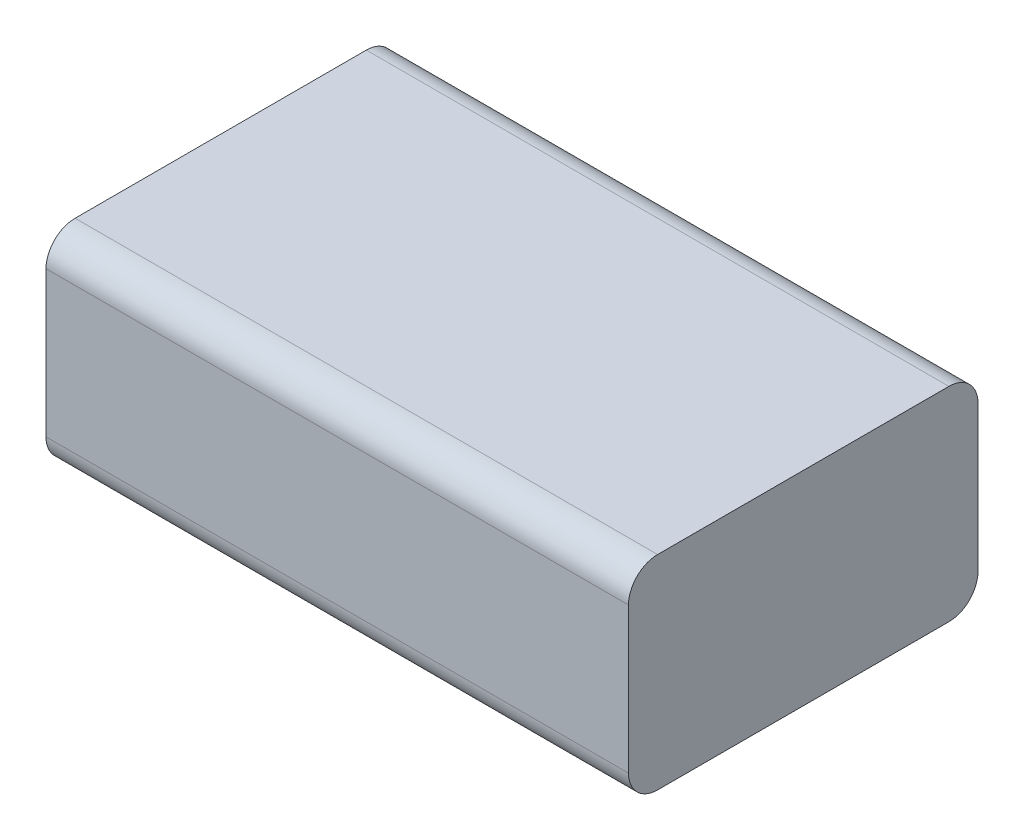
ISO-10303-21;
HEADER;
FILE_DESCRIPTION(('STEP AP214'),'2;1');
FILE_NAME('part.step','',(''),(''),'','','');
FILE_SCHEMA(('AUTOMOTIVE_DESIGN { 1 0 10303 214 1 1 1 1 }'));
ENDSEC;
DATA;
#1=APPLICATION_CONTEXT('core data for automotive mechanical design processes');
#2=APPLICATION_PROTOCOL_DEFINITION('international standard','automotive_design',2000,#1);
#3=PRODUCT_CONTEXT('',#1,'mechanical');
#4=PRODUCT('Part','Part','',(#3));
#5=PRODUCT_RELATED_PRODUCT_CATEGORY('part','',(#4));
#6=PRODUCT_DEFINITION_FORMATION('','',#4);
#7=PRODUCT_DEFINITION_CONTEXT('part definition',#1,'design');
#8=PRODUCT_DEFINITION('design','',#6,#7);
#9=PRODUCT_DEFINITION_SHAPE('','',#8);
#10=(LENGTH_UNIT() NAMED_UNIT(*) SI_UNIT(.MILLI.,.METRE.));
#11=(NAMED_UNIT(*) PLANE_ANGLE_UNIT() SI_UNIT($,.RADIAN.));
#12=(NAMED_UNIT(*) SI_UNIT($,.STERADIAN.) SOLID_ANGLE_UNIT());
#13=UNCERTAINTY_MEASURE_WITH_UNIT(LENGTH_MEASURE(1.E-05),#10,'distance_accuracy_value','');
#14=(GEOMETRIC_REPRESENTATION_CONTEXT(3) GLOBAL_UNCERTAINTY_ASSIGNED_CONTEXT((#13)) GLOBAL_UNIT_ASSIGNED_CONTEXT((#10,
#11,#12)) REPRESENTATION_CONTEXT('',''));
#15=CARTESIAN_POINT('',(0.,0.,0.));
#16=DIRECTION('',(0.,0.,1.));
#17=DIRECTION('',(1.,0.,0.));
#18=AXIS2_PLACEMENT_3D('',#15,#16,#17);
#19=CARTESIAN_POINT('',(50.,35.,30.));
#20=DIRECTION('',(-1.,0.,0.));
#21=DIRECTION('',(0.,0.,1.));
#22=AXIS2_PLACEMENT_3D('',#19,#20,#21);
#23=PLANE('',#22);
#24=DIRECTION('',(0.,0.,-1.));
#25=VECTOR('',#24,1.);
#26=CARTESIAN_POINT('',(50.,0.,30.));
#27=LINE('',#26,#25);
#28=CARTESIAN_POINT('',(50.,0.,25.));
#29=VERTEX_POINT('',#28);
#30=CARTESIAN_POINT('',(50.,0.,-25.));
#31=VERTEX_POINT('',#30);
#32=EDGE_CURVE('E142',#29,#31,#27,.T.);
#33=ORIENTED_EDGE('',*,*,#32,.T.);
#34=CARTESIAN_POINT('',(50.,5.,-25.));
#35=DIRECTION('',(-1.,0.,0.));
#36=DIRECTION('',(0.,0.,1.));
#37=AXIS2_PLACEMENT_3D('',#34,#35,#36);
#38=CIRCLE('',#37,5.);
#39=CARTESIAN_POINT('',(50.,5.,-30.));
#40=VERTEX_POINT('',#39);
#41=EDGE_CURVE('E11',#31,#40,#38,.F.);
#42=ORIENTED_EDGE('',*,*,#41,.T.);
#43=DIRECTION('',(0.,-1.,0.));
#44=VECTOR('',#43,1.);
#45=CARTESIAN_POINT('',(50.,35.,-30.));
#46=LINE('',#45,#44);
#47=CARTESIAN_POINT('',(50.,30.,-30.));
#48=VERTEX_POINT('',#47);
#49=EDGE_CURVE('E130',#48,#40,#46,.T.);
#50=ORIENTED_EDGE('',*,*,#49,.F.);
#51=CARTESIAN_POINT('',(50.,30.,-25.));
#52=DIRECTION('',(-1.,0.,0.));
#53=DIRECTION('',(0.,0.,1.));
#54=AXIS2_PLACEMENT_3D('',#51,#52,#53);
#55=CIRCLE('',#54,5.);
#56=CARTESIAN_POINT('',(50.,35.,-25.));
#57=VERTEX_POINT('',#56);
#58=EDGE_CURVE('E134',#48,#57,#55,.F.);
#59=ORIENTED_EDGE('',*,*,#58,.T.);
#60=DIRECTION('',(0.,0.,-1.));
#61=VECTOR('',#60,1.);
#62=CARTESIAN_POINT('',(50.,35.,30.));
#63=LINE('',#62,#61);
#64=CARTESIAN_POINT('',(50.,35.,25.));
#65=VERTEX_POINT('',#64);
#66=EDGE_CURVE('E124',#65,#57,#63,.T.);
#67=ORIENTED_EDGE('',*,*,#66,.F.);
#68=CARTESIAN_POINT('',(50.,30.,25.));
#69=DIRECTION('',(-1.,0.,0.));
#70=DIRECTION('',(0.,0.,1.));
#71=AXIS2_PLACEMENT_3D('',#68,#69,#70);
#72=CIRCLE('',#71,5.);
#73=CARTESIAN_POINT('',(50.,30.,30.));
#74=VERTEX_POINT('',#73);
#75=EDGE_CURVE('E108',#65,#74,#72,.F.);
#76=ORIENTED_EDGE('',*,*,#75,.T.);
#77=DIRECTION('',(0.,-1.,0.));
#78=VECTOR('',#77,1.);
#79=CARTESIAN_POINT('',(50.,35.,30.));
#80=LINE('',#79,#78);
#81=CARTESIAN_POINT('',(50.,5.,30.));
#82=VERTEX_POINT('',#81);
#83=EDGE_CURVE('E140',#74,#82,#80,.T.);
#84=ORIENTED_EDGE('',*,*,#83,.T.);
#85=CARTESIAN_POINT('',(50.,5.,25.));
#86=DIRECTION('',(-1.,0.,0.));
#87=DIRECTION('',(0.,0.,1.));
#88=AXIS2_PLACEMENT_3D('',#85,#86,#87);
#89=CIRCLE('',#88,5.);
#90=EDGE_CURVE('E179',#82,#29,#89,.F.);
#91=ORIENTED_EDGE('',*,*,#90,.T.);
#92=EDGE_LOOP('',(#33,#42,#50,#59,#67,#76,#84,#91));
#93=FACE_BOUND('',#92,.T.);
#94=ADVANCED_FACE('F43',(#93),#23,.F.);
#95=CARTESIAN_POINT('',(-50.,35.,-30.));
#96=DIRECTION('',(0.,0.,1.));
#97=DIRECTION('',(1.,0.,0.));
#98=AXIS2_PLACEMENT_3D('',#95,#96,#97);
#99=PLANE('',#98);
#100=ORIENTED_EDGE('',*,*,#49,.T.);
#101=DIRECTION('',(-1.,0.,0.));
#102=VECTOR('',#101,1.);
#103=CARTESIAN_POINT('',(-50.,5.,-30.));
#104=LINE('',#103,#102);
#105=CARTESIAN_POINT('',(-50.,5.,-30.));
#106=VERTEX_POINT('',#105);
#107=EDGE_CURVE('E189',#40,#106,#104,.T.);
#108=ORIENTED_EDGE('',*,*,#107,.T.);
#109=DIRECTION('',(0.,-1.,0.));
#110=VECTOR('',#109,1.);
#111=CARTESIAN_POINT('',(-50.,35.,-30.));
#112=LINE('',#111,#110);
#113=CARTESIAN_POINT('',(-50.,30.,-30.));
#114=VERTEX_POINT('',#113);
#115=EDGE_CURVE('E153',#114,#106,#112,.T.);
#116=ORIENTED_EDGE('',*,*,#115,.F.);
#117=DIRECTION('',(-1.,0.,0.));
#118=VECTOR('',#117,1.);
#119=CARTESIAN_POINT('',(-50.,30.,-30.));
#120=LINE('',#119,#118);
#121=EDGE_CURVE('E170',#114,#48,#120,.F.);
#122=ORIENTED_EDGE('',*,*,#121,.T.);
#123=EDGE_LOOP('',(#100,#108,#116,#122));
#124=FACE_BOUND('',#123,.T.);
#125=ADVANCED_FACE('F198',(#124),#99,.F.);
#126=CARTESIAN_POINT('',(-50.,35.,30.));
#127=DIRECTION('',(1.,0.,0.));
#128=DIRECTION('',(0.,0.,-1.));
#129=AXIS2_PLACEMENT_3D('',#126,#127,#128);
#130=PLANE('',#129);
#131=ORIENTED_EDGE('',*,*,#115,.T.);
#132=CARTESIAN_POINT('',(-50.,5.,-25.));
#133=DIRECTION('',(1.,0.,0.));
#134=DIRECTION('',(0.,0.,-1.));
#135=AXIS2_PLACEMENT_3D('',#132,#133,#134);
#136=CIRCLE('',#135,5.);
#137=CARTESIAN_POINT('',(-50.,0.,-25.));
#138=VERTEX_POINT('',#137);
#139=EDGE_CURVE('E66',#106,#138,#136,.F.);
#140=ORIENTED_EDGE('',*,*,#139,.T.);
#141=DIRECTION('',(0.,0.,1.));
#142=VECTOR('',#141,1.);
#143=CARTESIAN_POINT('',(-50.,0.,30.));
#144=LINE('',#143,#142);
#145=CARTESIAN_POINT('',(-50.,0.,25.));
#146=VERTEX_POINT('',#145);
#147=EDGE_CURVE('E136',#138,#146,#144,.T.);
#148=ORIENTED_EDGE('',*,*,#147,.T.);
#149=CARTESIAN_POINT('',(-50.,5.,25.));
#150=DIRECTION('',(1.,0.,0.));
#151=DIRECTION('',(0.,0.,-1.));
#152=AXIS2_PLACEMENT_3D('',#149,#150,#151);
#153=CIRCLE('',#152,5.);
#154=CARTESIAN_POINT('',(-50.,5.,30.));
#155=VERTEX_POINT('',#154);
#156=EDGE_CURVE('E186',#146,#155,#153,.F.);
#157=ORIENTED_EDGE('',*,*,#156,.T.);
#158=DIRECTION('',(0.,-1.,0.));
#159=VECTOR('',#158,1.);
#160=CARTESIAN_POINT('',(-50.,35.,30.));
#161=LINE('',#160,#159);
#162=CARTESIAN_POINT('',(-50.,30.,30.));
#163=VERTEX_POINT('',#162);
#164=EDGE_CURVE('E149',#163,#155,#161,.T.);
#165=ORIENTED_EDGE('',*,*,#164,.F.);
#166=CARTESIAN_POINT('',(-50.,30.,25.));
#167=DIRECTION('',(1.,0.,0.));
#168=DIRECTION('',(0.,0.,-1.));
#169=AXIS2_PLACEMENT_3D('',#166,#167,#168);
#170=CIRCLE('',#169,5.);
#171=CARTESIAN_POINT('',(-50.,35.,25.));
#172=VERTEX_POINT('',#171);
#173=EDGE_CURVE('E161',#163,#172,#170,.F.);
#174=ORIENTED_EDGE('',*,*,#173,.T.);
#175=DIRECTION('',(0.,0.,1.));
#176=VECTOR('',#175,1.);
#177=CARTESIAN_POINT('',(-50.,35.,30.));
#178=LINE('',#177,#176);
#179=CARTESIAN_POINT('',(-50.,35.,-25.));
#180=VERTEX_POINT('',#179);
#181=EDGE_CURVE('E127',#180,#172,#178,.T.);
#182=ORIENTED_EDGE('',*,*,#181,.F.);
#183=CARTESIAN_POINT('',(-50.,30.,-25.));
#184=DIRECTION('',(1.,0.,0.));
#185=DIRECTION('',(0.,0.,-1.));
#186=AXIS2_PLACEMENT_3D('',#183,#184,#185);
#187=CIRCLE('',#186,5.);
#188=EDGE_CURVE('E167',#180,#114,#187,.F.);
#189=ORIENTED_EDGE('',*,*,#188,.T.);
#190=EDGE_LOOP('',(#131,#140,#148,#157,#165,#174,#182,#189));
#191=FACE_BOUND('',#190,.T.);
#192=ADVANCED_FACE('F202',(#191),#130,.F.);
#193=CARTESIAN_POINT('',(-50.,35.,30.));
#194=DIRECTION('',(0.,0.,-1.));
#195=DIRECTION('',(-1.,0.,0.));
#196=AXIS2_PLACEMENT_3D('',#193,#194,#195);
#197=PLANE('',#196);
#198=ORIENTED_EDGE('',*,*,#164,.T.);
#199=DIRECTION('',(1.,0.,0.));
#200=VECTOR('',#199,1.);
#201=CARTESIAN_POINT('',(50.,5.,30.));
#202=LINE('',#201,#200);
#203=EDGE_CURVE('E175',#155,#82,#202,.T.);
#204=ORIENTED_EDGE('',*,*,#203,.T.);
#205=ORIENTED_EDGE('',*,*,#83,.F.);
#206=DIRECTION('',(1.,0.,0.));
#207=VECTOR('',#206,1.);
#208=CARTESIAN_POINT('',(-50.,30.,30.));
#209=LINE('',#208,#207);
#210=EDGE_CURVE('E113',#74,#163,#209,.F.);
#211=ORIENTED_EDGE('',*,*,#210,.T.);
#212=EDGE_LOOP('',(#198,#204,#205,#211));
#213=FACE_BOUND('',#212,.T.);
#214=ADVANCED_FACE('F240',(#213),#197,.F.);
#215=CARTESIAN_POINT('',(0.,35.,0.));
#216=DIRECTION('',(0.,-1.,0.));
#217=DIRECTION('',(0.,0.,-1.));
#218=AXIS2_PLACEMENT_3D('',#215,#216,#217);
#219=PLANE('',#218);
#220=ORIENTED_EDGE('',*,*,#66,.T.);
#221=DIRECTION('',(-1.,0.,0.));
#222=VECTOR('',#221,1.);
#223=CARTESIAN_POINT('',(0.,35.,-25.));
#224=LINE('',#223,#222);
#225=EDGE_CURVE('E164',#57,#180,#224,.T.);
#226=ORIENTED_EDGE('',*,*,#225,.T.);
#227=ORIENTED_EDGE('',*,*,#181,.T.);
#228=DIRECTION('',(1.,0.,0.));
#229=VECTOR('',#228,1.);
#230=CARTESIAN_POINT('',(0.,35.,25.));
#231=LINE('',#230,#229);
#232=EDGE_CURVE('E112',#172,#65,#231,.T.);
#233=ORIENTED_EDGE('',*,*,#232,.T.);
#234=EDGE_LOOP('',(#220,#226,#227,#233));
#235=FACE_BOUND('',#234,.T.);
#236=ADVANCED_FACE('F122',(#235),#219,.F.);
#237=CARTESIAN_POINT('',(0.,0.,0.));
#238=DIRECTION('',(0.,-1.,0.));
#239=DIRECTION('',(0.,0.,-1.));
#240=AXIS2_PLACEMENT_3D('',#237,#238,#239);
#241=PLANE('',#240);
#242=ORIENTED_EDGE('',*,*,#147,.F.);
#243=DIRECTION('',(-1.,0.,0.));
#244=VECTOR('',#243,1.);
#245=CARTESIAN_POINT('',(50.,0.,-25.));
#246=LINE('',#245,#244);
#247=EDGE_CURVE('E52',#138,#31,#246,.F.);
#248=ORIENTED_EDGE('',*,*,#247,.T.);
#249=ORIENTED_EDGE('',*,*,#32,.F.);
#250=DIRECTION('',(1.,0.,0.));
#251=VECTOR('',#250,1.);
#252=CARTESIAN_POINT('',(-50.,0.,25.));
#253=LINE('',#252,#251);
#254=EDGE_CURVE('E182',#29,#146,#253,.F.);
#255=ORIENTED_EDGE('',*,*,#254,.T.);
#256=EDGE_LOOP('',(#242,#248,#249,#255));
#257=FACE_BOUND('',#256,.T.);
#258=ADVANCED_FACE('F221',(#257),#241,.T.);
#259=CARTESIAN_POINT('',(0.,30.,25.));
#260=DIRECTION('',(1.,0.,0.));
#261=DIRECTION('',(0.,0.,-1.));
#262=AXIS2_PLACEMENT_3D('',#259,#260,#261);
#263=CYLINDRICAL_SURFACE('',#262,5.);
#264=ORIENTED_EDGE('',*,*,#173,.F.);
#265=ORIENTED_EDGE('',*,*,#210,.F.);
#266=ORIENTED_EDGE('',*,*,#75,.F.);
#267=ORIENTED_EDGE('',*,*,#232,.F.);
#268=EDGE_LOOP('',(#264,#265,#266,#267));
#269=FACE_BOUND('',#268,.T.);
#270=ADVANCED_FACE('F111',(#269),#263,.T.);
#271=CARTESIAN_POINT('',(0.,30.,-25.));
#272=DIRECTION('',(-1.,0.,0.));
#273=DIRECTION('',(0.,0.,1.));
#274=AXIS2_PLACEMENT_3D('',#271,#272,#273);
#275=CYLINDRICAL_SURFACE('',#274,5.);
#276=ORIENTED_EDGE('',*,*,#58,.F.);
#277=ORIENTED_EDGE('',*,*,#121,.F.);
#278=ORIENTED_EDGE('',*,*,#188,.F.);
#279=ORIENTED_EDGE('',*,*,#225,.F.);
#280=EDGE_LOOP('',(#276,#277,#278,#279));
#281=FACE_BOUND('',#280,.T.);
#282=ADVANCED_FACE('F204',(#281),#275,.T.);
#283=CARTESIAN_POINT('',(-50.,5.,25.));
#284=DIRECTION('',(-1.,0.,0.));
#285=DIRECTION('',(0.,0.,1.));
#286=AXIS2_PLACEMENT_3D('',#283,#284,#285);
#287=CYLINDRICAL_SURFACE('',#286,5.);
#288=ORIENTED_EDGE('',*,*,#156,.F.);
#289=ORIENTED_EDGE('',*,*,#254,.F.);
#290=ORIENTED_EDGE('',*,*,#90,.F.);
#291=ORIENTED_EDGE('',*,*,#203,.F.);
#292=EDGE_LOOP('',(#288,#289,#290,#291));
#293=FACE_BOUND('',#292,.T.);
#294=ADVANCED_FACE('F206',(#293),#287,.T.);
#295=CARTESIAN_POINT('',(-50.,5.,-25.));
#296=DIRECTION('',(1.,0.,0.));
#297=DIRECTION('',(0.,0.,-1.));
#298=AXIS2_PLACEMENT_3D('',#295,#296,#297);
#299=CYLINDRICAL_SURFACE('',#298,5.);
#300=ORIENTED_EDGE('',*,*,#41,.F.);
#301=ORIENTED_EDGE('',*,*,#247,.F.);
#302=ORIENTED_EDGE('',*,*,#139,.F.);
#303=ORIENTED_EDGE('',*,*,#107,.F.);
#304=EDGE_LOOP('',(#300,#301,#302,#303));
#305=FACE_BOUND('',#304,.T.);
#306=ADVANCED_FACE('F45',(#305),#299,.T.);
#307=CLOSED_SHELL('',(#94,#125,#192,#214,#236,#258,#270,#282,#294,#306));
#308=MANIFOLD_SOLID_BREP('B2',#307);
#309=ADVANCED_BREP_SHAPE_REPRESENTATION('',(#18,#308),#14);
#310=SHAPE_DEFINITION_REPRESENTATION(#9,#309);
ENDSEC;
END-ISO-10303-21;
